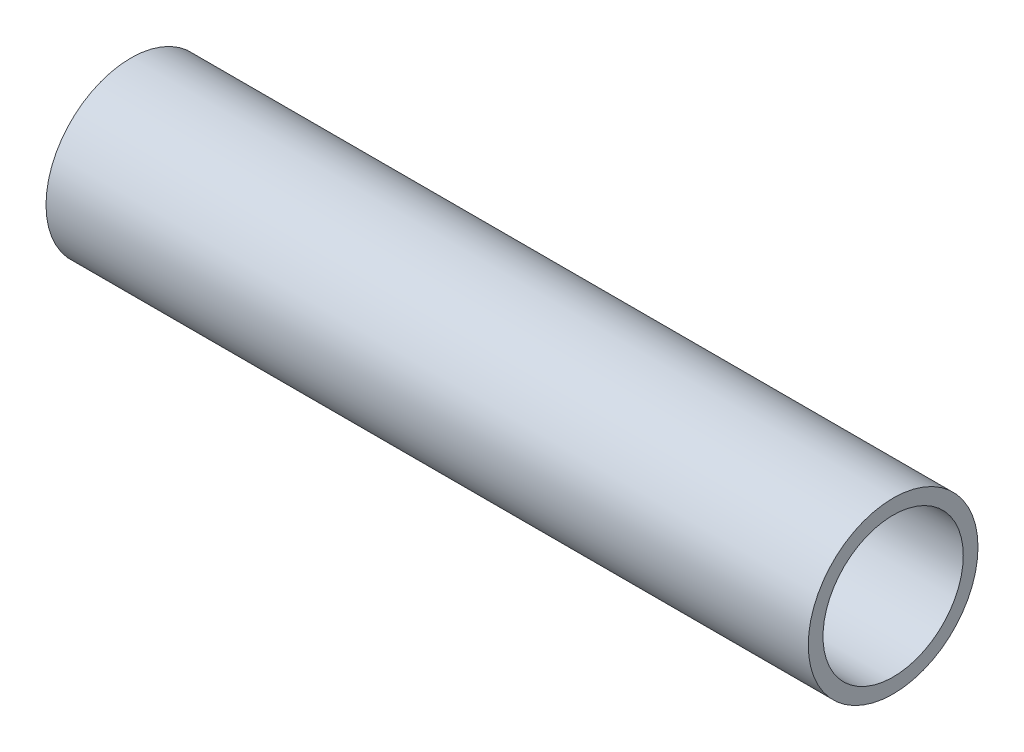
ISO-10303-21;
HEADER;
FILE_DESCRIPTION(('STEP AP214'),'2;1');
FILE_NAME('part.step','',(''),(''),'','','');
FILE_SCHEMA(('AUTOMOTIVE_DESIGN { 1 0 10303 214 1 1 1 1 }'));
ENDSEC;
DATA;
#1=APPLICATION_CONTEXT('core data for automotive mechanical design processes');
#2=APPLICATION_PROTOCOL_DEFINITION('international standard','automotive_design',2000,#1);
#3=PRODUCT_CONTEXT('',#1,'mechanical');
#4=PRODUCT('Part','Part','',(#3));
#5=PRODUCT_RELATED_PRODUCT_CATEGORY('part','',(#4));
#6=PRODUCT_DEFINITION_FORMATION('','',#4);
#7=PRODUCT_DEFINITION_CONTEXT('part definition',#1,'design');
#8=PRODUCT_DEFINITION('design','',#6,#7);
#9=PRODUCT_DEFINITION_SHAPE('','',#8);
#10=(LENGTH_UNIT() NAMED_UNIT(*) SI_UNIT(.MILLI.,.METRE.));
#11=(NAMED_UNIT(*) PLANE_ANGLE_UNIT() SI_UNIT($,.RADIAN.));
#12=(NAMED_UNIT(*) SI_UNIT($,.STERADIAN.) SOLID_ANGLE_UNIT());
#13=UNCERTAINTY_MEASURE_WITH_UNIT(LENGTH_MEASURE(1.E-05),#10,'distance_accuracy_value','');
#14=(GEOMETRIC_REPRESENTATION_CONTEXT(3) GLOBAL_UNCERTAINTY_ASSIGNED_CONTEXT((#13)) GLOBAL_UNIT_ASSIGNED_CONTEXT((#10,
#11,#12)) REPRESENTATION_CONTEXT('',''));
#15=CARTESIAN_POINT('',(0.,0.,0.));
#16=DIRECTION('',(0.,0.,1.));
#17=DIRECTION('',(1.,0.,0.));
#18=AXIS2_PLACEMENT_3D('',#15,#16,#17);
#19=CARTESIAN_POINT('',(150.,0.,0.));
#20=DIRECTION('',(1.,0.,0.));
#21=DIRECTION('',(0.,0.,-1.));
#22=AXIS2_PLACEMENT_3D('',#19,#20,#21);
#23=PLANE('',#22);
#24=CARTESIAN_POINT('',(150.,0.,0.));
#25=DIRECTION('',(1.,0.,0.));
#26=DIRECTION('',(0.,0.,-1.));
#27=AXIS2_PLACEMENT_3D('',#24,#25,#26);
#28=CIRCLE('',#27,16.7);
#29=CARTESIAN_POINT('',(150.,0.,-16.7));
#30=VERTEX_POINT('',#29);
#31=EDGE_CURVE('E12',#30,#30,#28,.T.);
#32=ORIENTED_EDGE('',*,*,#31,.T.);
#33=EDGE_LOOP('',(#32));
#34=FACE_BOUND('',#33,.T.);
#35=CARTESIAN_POINT('',(150.,0.,0.));
#36=DIRECTION('',(1.,0.,0.));
#37=DIRECTION('',(0.,0.,-1.));
#38=AXIS2_PLACEMENT_3D('',#35,#36,#37);
#39=CIRCLE('',#38,13.8);
#40=CARTESIAN_POINT('',(150.,0.,-13.8));
#41=VERTEX_POINT('',#40);
#42=EDGE_CURVE('E51',#41,#41,#39,.T.);
#43=ORIENTED_EDGE('',*,*,#42,.F.);
#44=EDGE_LOOP('',(#43));
#45=FACE_BOUND('',#44,.T.);
#46=ADVANCED_FACE('F40',(#34,#45),#23,.T.);
#47=CARTESIAN_POINT('',(0.,0.,0.));
#48=DIRECTION('',(1.,0.,0.));
#49=DIRECTION('',(0.,0.,-1.));
#50=AXIS2_PLACEMENT_3D('',#47,#48,#49);
#51=PLANE('',#50);
#52=CARTESIAN_POINT('',(0.,0.,0.));
#53=DIRECTION('',(1.,0.,0.));
#54=DIRECTION('',(0.,0.,-1.));
#55=AXIS2_PLACEMENT_3D('',#52,#53,#54);
#56=CIRCLE('',#55,16.7);
#57=CARTESIAN_POINT('',(0.,0.,-16.7));
#58=VERTEX_POINT('',#57);
#59=EDGE_CURVE('E44',#58,#58,#56,.T.);
#60=ORIENTED_EDGE('',*,*,#59,.F.);
#61=EDGE_LOOP('',(#60));
#62=FACE_BOUND('',#61,.T.);
#63=CARTESIAN_POINT('',(0.,0.,0.));
#64=DIRECTION('',(1.,0.,0.));
#65=DIRECTION('',(0.,0.,-1.));
#66=AXIS2_PLACEMENT_3D('',#63,#64,#65);
#67=CIRCLE('',#66,13.8);
#68=CARTESIAN_POINT('',(0.,0.,-13.8));
#69=VERTEX_POINT('',#68);
#70=EDGE_CURVE('E53',#69,#69,#67,.T.);
#71=ORIENTED_EDGE('',*,*,#70,.T.);
#72=EDGE_LOOP('',(#71));
#73=FACE_BOUND('',#72,.T.);
#74=ADVANCED_FACE('F63',(#62,#73),#51,.F.);
#75=CARTESIAN_POINT('',(150.,0.,0.));
#76=DIRECTION('',(-1.,0.,0.));
#77=DIRECTION('',(0.,0.,1.));
#78=AXIS2_PLACEMENT_3D('',#75,#76,#77);
#79=CYLINDRICAL_SURFACE('',#78,16.7);
#80=ORIENTED_EDGE('',*,*,#31,.F.);
#81=EDGE_LOOP('',(#80));
#82=FACE_BOUND('',#81,.T.);
#83=ORIENTED_EDGE('',*,*,#59,.T.);
#84=EDGE_LOOP('',(#83));
#85=FACE_BOUND('',#84,.T.);
#86=ADVANCED_FACE('F42',(#82,#85),#79,.T.);
#87=CARTESIAN_POINT('',(150.,0.,0.));
#88=DIRECTION('',(-1.,0.,0.));
#89=DIRECTION('',(0.,0.,1.));
#90=AXIS2_PLACEMENT_3D('',#87,#88,#89);
#91=CYLINDRICAL_SURFACE('',#90,13.8);
#92=ORIENTED_EDGE('',*,*,#42,.T.);
#93=EDGE_LOOP('',(#92));
#94=FACE_BOUND('',#93,.T.);
#95=ORIENTED_EDGE('',*,*,#70,.F.);
#96=EDGE_LOOP('',(#95));
#97=FACE_BOUND('',#96,.T.);
#98=ADVANCED_FACE('F59',(#94,#97),#91,.F.);
#99=CLOSED_SHELL('',(#46,#74,#86,#98));
#100=MANIFOLD_SOLID_BREP('B2',#99);
#101=ADVANCED_BREP_SHAPE_REPRESENTATION('',(#18,#100),#14);
#102=SHAPE_DEFINITION_REPRESENTATION(#9,#101);
ENDSEC;
END-ISO-10303-21;
